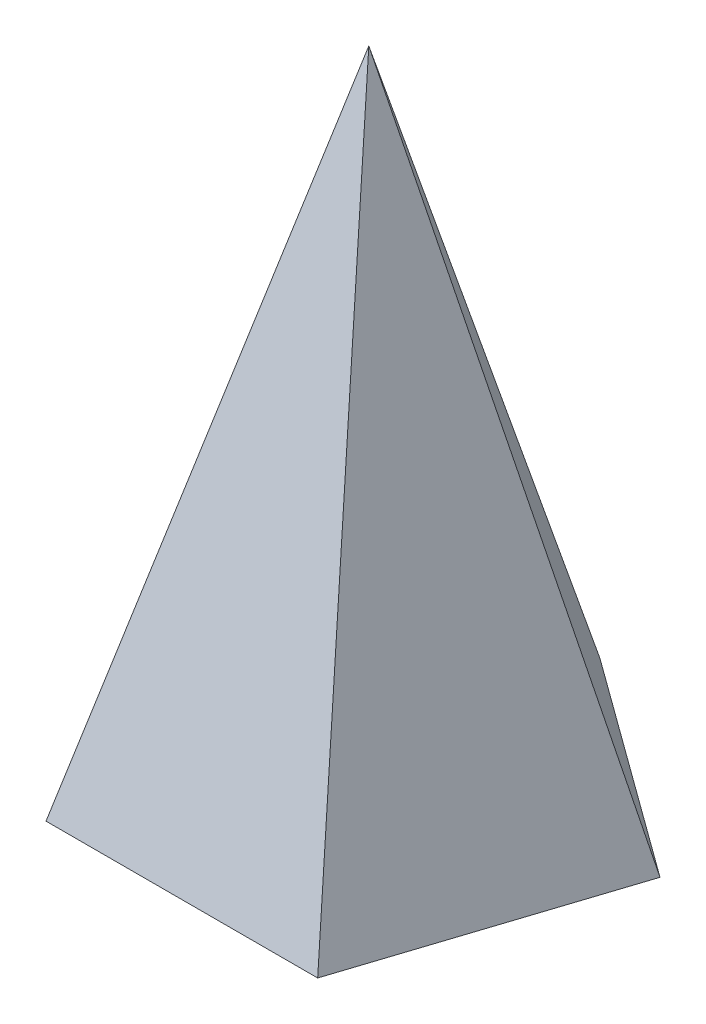
ISO-10303-21;
HEADER;
FILE_DESCRIPTION(('STEP AP214'),'2;1');
FILE_NAME('part.step','',(''),(''),'','','');
FILE_SCHEMA(('AUTOMOTIVE_DESIGN { 1 0 10303 214 1 1 1 1 }'));
ENDSEC;
DATA;
#1=APPLICATION_CONTEXT('core data for automotive mechanical design processes');
#2=APPLICATION_PROTOCOL_DEFINITION('international standard','automotive_design',2000,#1);
#3=PRODUCT_CONTEXT('',#1,'mechanical');
#4=PRODUCT('Part','Part','',(#3));
#5=PRODUCT_RELATED_PRODUCT_CATEGORY('part','',(#4));
#6=PRODUCT_DEFINITION_FORMATION('','',#4);
#7=PRODUCT_DEFINITION_CONTEXT('part definition',#1,'design');
#8=PRODUCT_DEFINITION('design','',#6,#7);
#9=PRODUCT_DEFINITION_SHAPE('','',#8);
#10=(LENGTH_UNIT() NAMED_UNIT(*) SI_UNIT(.MILLI.,.METRE.));
#11=(NAMED_UNIT(*) PLANE_ANGLE_UNIT() SI_UNIT($,.RADIAN.));
#12=(NAMED_UNIT(*) SI_UNIT($,.STERADIAN.) SOLID_ANGLE_UNIT());
#13=UNCERTAINTY_MEASURE_WITH_UNIT(LENGTH_MEASURE(1.E-05),#10,'distance_accuracy_value','');
#14=(GEOMETRIC_REPRESENTATION_CONTEXT(3) GLOBAL_UNCERTAINTY_ASSIGNED_CONTEXT((#13)) GLOBAL_UNIT_ASSIGNED_CONTEXT((#10,
#11,#12)) REPRESENTATION_CONTEXT('',''));
#15=CARTESIAN_POINT('',(0.,0.,0.));
#16=DIRECTION('',(0.,0.,1.));
#17=DIRECTION('',(1.,0.,0.));
#18=AXIS2_PLACEMENT_3D('',#15,#16,#17);
#19=CARTESIAN_POINT('',(0.,0.,0.));
#20=DIRECTION('',(0.,1.,0.));
#21=DIRECTION('',(0.,0.,1.));
#22=AXIS2_PLACEMENT_3D('',#19,#20,#21);
#23=PLANE('',#22);
#24=DIRECTION('',(-0.809016994374947,0.,0.587785252292473));
#25=VECTOR('',#24,1.);
#26=CARTESIAN_POINT('',(0.,0.,-28.0884896917844));
#27=LINE('',#26,#25);
#28=CARTESIAN_POINT('',(0.,0.,-28.0884896917844));
#29=VERTEX_POINT('',#28);
#30=CARTESIAN_POINT('',(-26.7137411542608,0.,-8.6798206610869));
#31=VERTEX_POINT('',#30);
#32=EDGE_CURVE('E83',#29,#31,#27,.T.);
#33=ORIENTED_EDGE('',*,*,#32,.F.);
#34=DIRECTION('',(-0.809016994374948,0.,-0.587785252292473));
#35=VECTOR('',#34,1.);
#36=CARTESIAN_POINT('',(26.7137411542608,0.,-8.67982066108691));
#37=LINE('',#36,#35);
#38=CARTESIAN_POINT('',(26.7137411542608,0.,-8.67982066108691));
#39=VERTEX_POINT('',#38);
#40=EDGE_CURVE('E104',#39,#29,#37,.T.);
#41=ORIENTED_EDGE('',*,*,#40,.F.);
#42=DIRECTION('',(0.309016994374947,0.,-0.951056516295154));
#43=VECTOR('',#42,1.);
#44=CARTESIAN_POINT('',(16.51,0.,22.7240655069791));
#45=LINE('',#44,#43);
#46=CARTESIAN_POINT('',(16.51,0.,22.7240655069791));
#47=VERTEX_POINT('',#46);
#48=EDGE_CURVE('E107',#47,#39,#45,.T.);
#49=ORIENTED_EDGE('',*,*,#48,.F.);
#50=DIRECTION('',(1.,0.,0.));
#51=VECTOR('',#50,1.);
#52=CARTESIAN_POINT('',(-16.51,0.,22.7240655069791));
#53=LINE('',#52,#51);
#54=CARTESIAN_POINT('',(-16.51,0.,22.7240655069791));
#55=VERTEX_POINT('',#54);
#56=EDGE_CURVE('E85',#55,#47,#53,.T.);
#57=ORIENTED_EDGE('',*,*,#56,.F.);
#58=DIRECTION('',(0.309016994374947,0.,0.951056516295154));
#59=VECTOR('',#58,1.);
#60=CARTESIAN_POINT('',(-26.7137411542608,0.,-8.6798206610869));
#61=LINE('',#60,#59);
#62=EDGE_CURVE('E81',#31,#55,#61,.T.);
#63=ORIENTED_EDGE('',*,*,#62,.F.);
#64=EDGE_LOOP('',(#33,#41,#49,#57,#63));
#65=FACE_BOUND('',#64,.T.);
#66=ADVANCED_FACE('F42',(#65),#23,.F.);
#67=CARTESIAN_POINT('',(-12.3237949036119,6.07043220517541,-16.9622484969262));
#68=DIRECTION('',(0.564596988571781,-0.278108145192086,0.777101087422669));
#69=DIRECTION('',(0.809016994374947,0.,-0.587785252292473));
#70=AXIS2_PLACEMENT_3D('',#67,#68,#69);
#71=PLANE('',#70);
#72=DIRECTION('',(0.320459444043215,0.94152218440449,0.104123585213487));
#73=VECTOR('',#72,1.);
#74=CARTESIAN_POINT('',(-26.7137411542608,0.,-8.6798206610869));
#75=LINE('',#74,#73);
#76=CARTESIAN_POINT('',(0.,78.486,0.));
#77=VERTEX_POINT('',#76);
#78=EDGE_CURVE('E97',#31,#77,#75,.T.);
#79=ORIENTED_EDGE('',*,*,#78,.T.);
#80=DIRECTION('',(0.,0.94152218440449,0.336950999811837));
#81=VECTOR('',#80,1.);
#82=CARTESIAN_POINT('',(0.,0.,-28.0884896917844));
#83=LINE('',#82,#81);
#84=EDGE_CURVE('E62',#29,#77,#83,.T.);
#85=ORIENTED_EDGE('',*,*,#84,.F.);
#86=ORIENTED_EDGE('',*,*,#32,.T.);
#87=EDGE_LOOP('',(#79,#85,#86));
#88=FACE_BOUND('',#87,.T.);
#89=ADVANCED_FACE('F96',(#88),#71,.F.);
#90=CARTESIAN_POINT('',(12.3237949036119,6.07043220517542,-16.9622484969262));
#91=DIRECTION('',(-0.564596988571781,-0.278108145192086,0.777101087422669));
#92=DIRECTION('',(0.809016994374947,0.,0.587785252292473));
#93=AXIS2_PLACEMENT_3D('',#90,#91,#92);
#94=PLANE('',#93);
#95=ORIENTED_EDGE('',*,*,#84,.T.);
#96=DIRECTION('',(-0.320459444043215,0.94152218440449,0.104123585213487));
#97=VECTOR('',#96,1.);
#98=CARTESIAN_POINT('',(26.7137411542608,0.,-8.67982066108691));
#99=LINE('',#98,#97);
#100=EDGE_CURVE('E12',#39,#77,#99,.T.);
#101=ORIENTED_EDGE('',*,*,#100,.F.);
#102=ORIENTED_EDGE('',*,*,#40,.T.);
#103=EDGE_LOOP('',(#95,#101,#102));
#104=FACE_BOUND('',#103,.T.);
#105=ADVANCED_FACE('F129',(#104),#94,.F.);
#106=CARTESIAN_POINT('',(-19.9403190244268,6.07043220517542,6.479002400204));
#107=DIRECTION('',(0.913537117454977,-0.278108145192086,-0.296826202700956));
#108=DIRECTION('',(-0.309016994374947,0.,-0.951056516295154));
#109=AXIS2_PLACEMENT_3D('',#106,#107,#108);
#110=PLANE('',#109);
#111=DIRECTION('',(0.198054828434602,0.94152218440449,-0.272599085119406));
#112=VECTOR('',#111,1.);
#113=CARTESIAN_POINT('',(-16.51,0.,22.7240655069791));
#114=LINE('',#113,#112);
#115=EDGE_CURVE('E102',#55,#77,#114,.T.);
#116=ORIENTED_EDGE('',*,*,#115,.T.);
#117=ORIENTED_EDGE('',*,*,#78,.F.);
#118=ORIENTED_EDGE('',*,*,#62,.T.);
#119=EDGE_LOOP('',(#116,#117,#118));
#120=FACE_BOUND('',#119,.T.);
#121=ADVANCED_FACE('F101',(#120),#110,.F.);
#122=CARTESIAN_POINT('',(0.,6.07043220517541,20.9664921934444));
#123=DIRECTION('',(0.,-0.278108145192086,-0.960549769443425));
#124=DIRECTION('',(0.,0.960549769443425,-0.278108145192086));
#125=AXIS2_PLACEMENT_3D('',#122,#123,#124);
#126=PLANE('',#125);
#127=DIRECTION('',(-0.198054828434602,0.94152218440449,-0.272599085119406));
#128=VECTOR('',#127,1.);
#129=CARTESIAN_POINT('',(16.51,0.,22.7240655069791));
#130=LINE('',#129,#128);
#131=EDGE_CURVE('E54',#47,#77,#130,.T.);
#132=ORIENTED_EDGE('',*,*,#131,.T.);
#133=ORIENTED_EDGE('',*,*,#115,.F.);
#134=ORIENTED_EDGE('',*,*,#56,.T.);
#135=EDGE_LOOP('',(#132,#133,#134));
#136=FACE_BOUND('',#135,.T.);
#137=ADVANCED_FACE('F128',(#136),#126,.F.);
#138=CARTESIAN_POINT('',(19.9403190244268,6.07043220517541,6.479002400204));
#139=DIRECTION('',(-0.913537117454977,-0.278108145192086,-0.296826202700956));
#140=DIRECTION('',(-0.309016994374947,0.,0.951056516295154));
#141=AXIS2_PLACEMENT_3D('',#138,#139,#140);
#142=PLANE('',#141);
#143=ORIENTED_EDGE('',*,*,#100,.T.);
#144=ORIENTED_EDGE('',*,*,#131,.F.);
#145=ORIENTED_EDGE('',*,*,#48,.T.);
#146=EDGE_LOOP('',(#143,#144,#145));
#147=FACE_BOUND('',#146,.T.);
#148=ADVANCED_FACE('F44',(#147),#142,.F.);
#149=CLOSED_SHELL('',(#66,#89,#105,#121,#137,#148));
#150=MANIFOLD_SOLID_BREP('B2',#149);
#151=ADVANCED_BREP_SHAPE_REPRESENTATION('',(#18,#150),#14);
#152=SHAPE_DEFINITION_REPRESENTATION(#9,#151);
ENDSEC;
END-ISO-10303-21;
